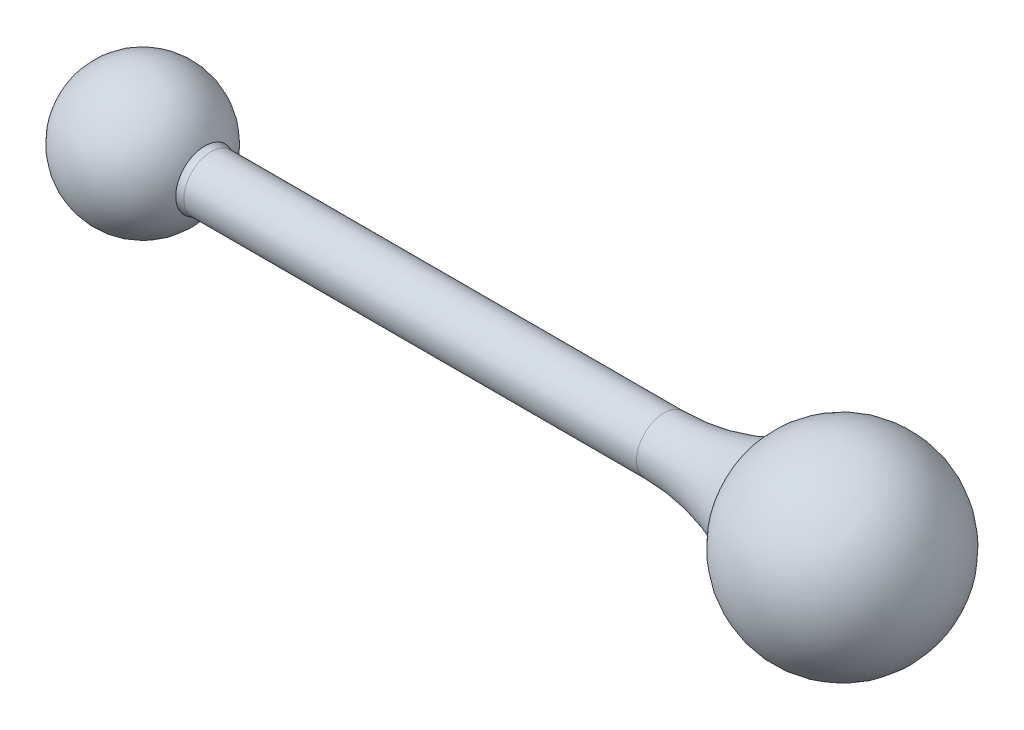
ISO-10303-21;
HEADER;
FILE_DESCRIPTION(('STEP AP214'),'2;1');
FILE_NAME('part.step','',(''),(''),'','','');
FILE_SCHEMA(('AUTOMOTIVE_DESIGN { 1 0 10303 214 1 1 1 1 }'));
ENDSEC;
DATA;
#1=APPLICATION_CONTEXT('core data for automotive mechanical design processes');
#2=APPLICATION_PROTOCOL_DEFINITION('international standard','automotive_design',2000,#1);
#3=PRODUCT_CONTEXT('',#1,'mechanical');
#4=PRODUCT('Part','Part','',(#3));
#5=PRODUCT_RELATED_PRODUCT_CATEGORY('part','',(#4));
#6=PRODUCT_DEFINITION_FORMATION('','',#4);
#7=PRODUCT_DEFINITION_CONTEXT('part definition',#1,'design');
#8=PRODUCT_DEFINITION('design','',#6,#7);
#9=PRODUCT_DEFINITION_SHAPE('','',#8);
#10=(LENGTH_UNIT() NAMED_UNIT(*) SI_UNIT(.MILLI.,.METRE.));
#11=(NAMED_UNIT(*) PLANE_ANGLE_UNIT() SI_UNIT($,.RADIAN.));
#12=(NAMED_UNIT(*) SI_UNIT($,.STERADIAN.) SOLID_ANGLE_UNIT());
#13=UNCERTAINTY_MEASURE_WITH_UNIT(LENGTH_MEASURE(1.E-05),#10,'distance_accuracy_value','');
#14=(GEOMETRIC_REPRESENTATION_CONTEXT(3) GLOBAL_UNCERTAINTY_ASSIGNED_CONTEXT((#13)) GLOBAL_UNIT_ASSIGNED_CONTEXT((#10,
#11,#12)) REPRESENTATION_CONTEXT('',''));
#15=CARTESIAN_POINT('',(0.,0.,0.));
#16=DIRECTION('',(0.,0.,1.));
#17=DIRECTION('',(1.,0.,0.));
#18=AXIS2_PLACEMENT_3D('',#15,#16,#17);
#19=CARTESIAN_POINT('',(-7.,0.,0.));
#20=DIRECTION('',(1.,0.,0.));
#21=DIRECTION('',(0.,-1.,0.));
#22=AXIS2_PLACEMENT_3D('',#19,#20,#21);
#23=SPHERICAL_SURFACE('',#22,7.);
#24=CARTESIAN_POINT('',(-13.0775343120244,0.,0.));
#25=DIRECTION('',(-1.,0.,0.));
#26=DIRECTION('',(0.,0.,1.));
#27=AXIS2_PLACEMENT_3D('',#24,#25,#26);
#28=CIRCLE('',#27,3.47326599703594);
#29=CARTESIAN_POINT('',(-13.0775343120244,0.,3.47326599703594));
#30=VERTEX_POINT('',#29);
#31=EDGE_CURVE('E10',#30,#30,#28,.T.);
#32=ORIENTED_EDGE('',*,*,#31,.F.);
#33=EDGE_LOOP('',(#32));
#34=FACE_BOUND('',#33,.T.);
#35=ADVANCED_FACE('F15',(#34),#23,.T.);
#36=CARTESIAN_POINT('',(-58.,0.,0.));
#37=DIRECTION('',(1.,0.,0.));
#38=DIRECTION('',(0.,-1.,0.));
#39=AXIS2_PLACEMENT_3D('',#36,#37,#38);
#40=SPHERICAL_SURFACE('',#39,5.);
#41=CARTESIAN_POINT('',(-53.4705882352941,0.,0.));
#42=DIRECTION('',(1.,0.,0.));
#43=DIRECTION('',(0.,0.,-1.));
#44=AXIS2_PLACEMENT_3D('',#41,#42,#43);
#45=CIRCLE('',#44,2.11764705882354);
#46=CARTESIAN_POINT('',(-53.4705882352941,0.,-2.11764705882354));
#47=VERTEX_POINT('',#46);
#48=EDGE_CURVE('E22',#47,#47,#45,.T.);
#49=ORIENTED_EDGE('',*,*,#48,.F.);
#50=EDGE_LOOP('',(#49));
#51=FACE_BOUND('',#50,.T.);
#52=ADVANCED_FACE('F50',(#51),#40,.T.);
#53=CARTESIAN_POINT('',(-53.,0.,0.));
#54=DIRECTION('',(1.,0.,0.));
#55=DIRECTION('',(0.,0.,-1.));
#56=AXIS2_PLACEMENT_3D('',#53,#54,#55);
#57=TOROIDAL_SURFACE('',#56,3.,1.);
#58=CARTESIAN_POINT('',(-53.,0.,0.));
#59=DIRECTION('',(1.,0.,0.));
#60=DIRECTION('',(0.,0.,-1.));
#61=AXIS2_PLACEMENT_3D('',#58,#59,#60);
#62=CIRCLE('',#61,2.);
#63=CARTESIAN_POINT('',(-53.,0.,-2.));
#64=VERTEX_POINT('',#63);
#65=EDGE_CURVE('E28',#64,#64,#62,.T.);
#66=ORIENTED_EDGE('',*,*,#65,.F.);
#67=EDGE_LOOP('',(#66));
#68=FACE_BOUND('',#67,.T.);
#69=ORIENTED_EDGE('',*,*,#48,.T.);
#70=EDGE_LOOP('',(#69));
#71=FACE_BOUND('',#70,.T.);
#72=ADVANCED_FACE('F45',(#68,#71),#57,.F.);
#73=CARTESIAN_POINT('',(0.,0.,0.));
#74=DIRECTION('',(1.,0.,0.));
#75=DIRECTION('',(0.,0.,-1.));
#76=AXIS2_PLACEMENT_3D('',#73,#74,#75);
#77=CYLINDRICAL_SURFACE('',#76,2.);
#78=CARTESIAN_POINT('',(-20.,0.,0.));
#79=DIRECTION('',(1.,0.,0.));
#80=DIRECTION('',(0.,0.,-1.));
#81=AXIS2_PLACEMENT_3D('',#78,#79,#80);
#82=CIRCLE('',#81,2.);
#83=CARTESIAN_POINT('',(-20.,0.,-2.));
#84=VERTEX_POINT('',#83);
#85=EDGE_CURVE('E33',#84,#84,#82,.T.);
#86=ORIENTED_EDGE('',*,*,#85,.F.);
#87=EDGE_LOOP('',(#86));
#88=FACE_BOUND('',#87,.T.);
#89=ORIENTED_EDGE('',*,*,#65,.T.);
#90=EDGE_LOOP('',(#89));
#91=FACE_BOUND('',#90,.T.);
#92=ADVANCED_FACE('F42',(#88,#91),#77,.T.);
#93=CARTESIAN_POINT('',(-20.,0.,0.));
#94=DIRECTION('',(1.,0.,0.));
#95=DIRECTION('',(0.,0.,-1.));
#96=AXIS2_PLACEMENT_3D('',#93,#94,#95);
#97=TOROIDAL_SURFACE('',#96,19.,17.);
#98=ORIENTED_EDGE('',*,*,#31,.T.);
#99=EDGE_LOOP('',(#98));
#100=FACE_BOUND('',#99,.T.);
#101=ORIENTED_EDGE('',*,*,#85,.T.);
#102=EDGE_LOOP('',(#101));
#103=FACE_BOUND('',#102,.T.);
#104=ADVANCED_FACE('F40',(#100,#103),#97,.F.);
#105=CLOSED_SHELL('',(#35,#52,#72,#92,#104));
#106=MANIFOLD_SOLID_BREP('B1',#105);
#107=ADVANCED_BREP_SHAPE_REPRESENTATION('',(#18,#106),#14);
#108=SHAPE_DEFINITION_REPRESENTATION(#9,#107);
ENDSEC;
END-ISO-10303-21;
